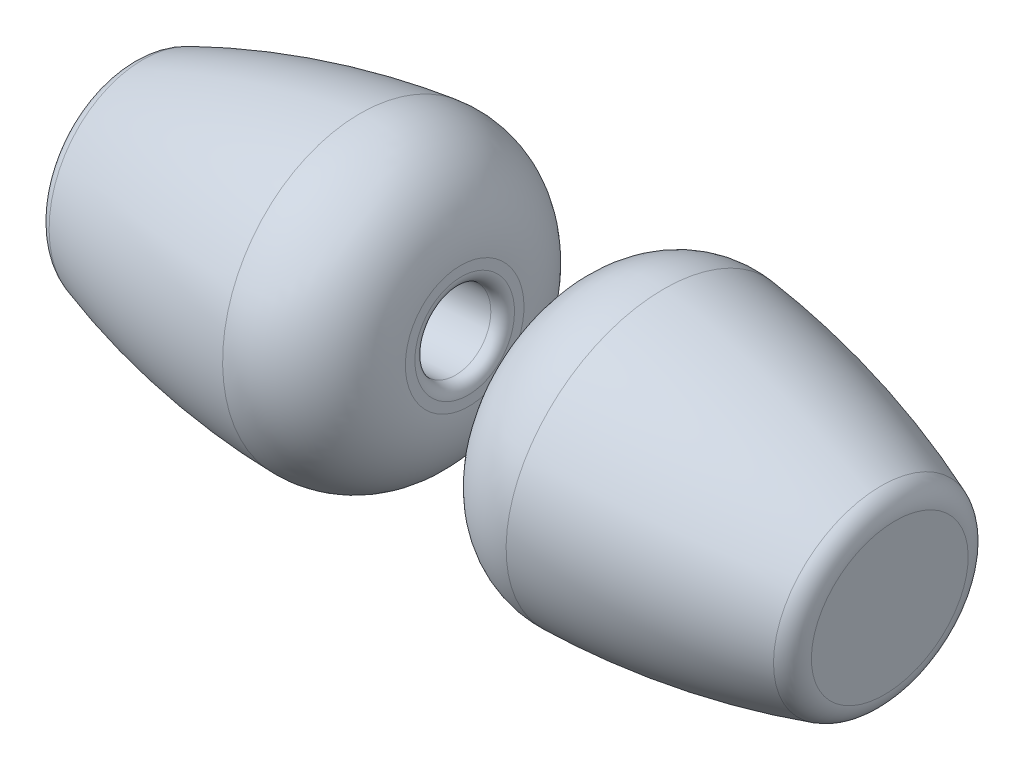
ISO-10303-21;
HEADER;
FILE_DESCRIPTION(('STEP AP214'),'2;1');
FILE_NAME('part.step','',(''),(''),'','','');
FILE_SCHEMA(('AUTOMOTIVE_DESIGN { 1 0 10303 214 1 1 1 1 }'));
ENDSEC;
DATA;
#1=APPLICATION_CONTEXT('core data for automotive mechanical design processes');
#2=APPLICATION_PROTOCOL_DEFINITION('international standard','automotive_design',2000,#1);
#3=PRODUCT_CONTEXT('',#1,'mechanical');
#4=PRODUCT('Part','Part','',(#3));
#5=PRODUCT_RELATED_PRODUCT_CATEGORY('part','',(#4));
#6=PRODUCT_DEFINITION_FORMATION('','',#4);
#7=PRODUCT_DEFINITION_CONTEXT('part definition',#1,'design');
#8=PRODUCT_DEFINITION('design','',#6,#7);
#9=PRODUCT_DEFINITION_SHAPE('','',#8);
#10=(LENGTH_UNIT() NAMED_UNIT(*) SI_UNIT(.MILLI.,.METRE.));
#11=(NAMED_UNIT(*) PLANE_ANGLE_UNIT() SI_UNIT($,.RADIAN.));
#12=(NAMED_UNIT(*) SI_UNIT($,.STERADIAN.) SOLID_ANGLE_UNIT());
#13=UNCERTAINTY_MEASURE_WITH_UNIT(LENGTH_MEASURE(1.E-05),#10,'distance_accuracy_value','');
#14=(GEOMETRIC_REPRESENTATION_CONTEXT(3) GLOBAL_UNCERTAINTY_ASSIGNED_CONTEXT((#13)) GLOBAL_UNIT_ASSIGNED_CONTEXT((#10,
#11,#12)) REPRESENTATION_CONTEXT('',''));
#15=CARTESIAN_POINT('',(0.,0.,0.));
#16=DIRECTION('',(0.,0.,1.));
#17=DIRECTION('',(1.,0.,0.));
#18=AXIS2_PLACEMENT_3D('',#15,#16,#17);
#19=CARTESIAN_POINT('',(-16.242863651309,160.834457444389,0.));
#20=DIRECTION('',(-0.997611399366225,-0.0690760150454681,0.));
#21=DIRECTION('',(-0.0690760150454681,0.997611399366225,0.));
#22=AXIS2_PLACEMENT_3D('',#19,#20,#21);
#23=PLANE('',#22);
#24=CARTESIAN_POINT('',(-15.9665595911271,156.844011846924,0.));
#25=DIRECTION('',(0.997611399366225,0.0690760150454681,0.));
#26=DIRECTION('',(-0.0690760150454681,0.997611399366225,0.));
#27=AXIS2_PLACEMENT_3D('',#24,#25,#26);
#28=CIRCLE('',#27,3.30542503677639);
#29=CARTESIAN_POINT('',(-16.1948851806992,160.141541543363,0.));
#30=VERTEX_POINT('',#29);
#31=EDGE_CURVE('E60',#30,#30,#28,.T.);
#32=ORIENTED_EDGE('',*,*,#31,.F.);
#33=EDGE_LOOP('',(#32));
#34=FACE_BOUND('',#33,.T.);
#35=ADVANCED_FACE('F45',(#34),#23,.T.);
#36=CARTESIAN_POINT('',(-3.52244998302165,157.705659481527,0.));
#37=DIRECTION('',(-0.997611399366225,-0.0690760150454681,0.));
#38=DIRECTION('',(-0.0690760150454681,0.997611399366225,0.));
#39=AXIS2_PLACEMENT_3D('',#36,#37,#38);
#40=DEGENERATE_TOROIDAL_SURFACE('',#39,28.4780833032829,34.7911511111625,.F.);
#41=CARTESIAN_POINT('',(-15.3076906681887,156.889632856932,0.));
#42=DIRECTION('',(-0.997611399366225,-0.0690760150454681,0.));
#43=DIRECTION('',(0.0690760150454681,-0.997611399366225,0.));
#44=AXIS2_PLACEMENT_3D('',#41,#42,#43);
#45=CIRCLE('',#44,4.24601176717516);
#46=CARTESIAN_POINT('',(-15.014393095476,152.653763116155,0.));
#47=VERTEX_POINT('',#46);
#48=EDGE_CURVE('E56',#47,#47,#45,.T.);
#49=ORIENTED_EDGE('',*,*,#48,.F.);
#50=EDGE_LOOP('',(#49));
#51=FACE_BOUND('',#50,.T.);
#52=CARTESIAN_POINT('',(-5.9904455974649,157.534771997379,0.));
#53=DIRECTION('',(0.997611399366225,0.0690760150454681,0.));
#54=DIRECTION('',(-0.0690760150454681,0.997611399366225,0.));
#55=AXIS2_PLACEMENT_3D('',#52,#53,#54);
#56=CIRCLE('',#55,6.225);
#57=CARTESIAN_POINT('',(-6.42044379112294,163.744902958434,0.));
#58=VERTEX_POINT('',#57);
#59=EDGE_CURVE('E65',#58,#58,#56,.T.);
#60=ORIENTED_EDGE('',*,*,#59,.F.);
#61=EDGE_LOOP('',(#60));
#62=FACE_BOUND('',#61,.T.);
#63=ADVANCED_FACE('F88',(#51,#62),#40,.F.);
#64=CARTESIAN_POINT('',(-5.7255330078988,157.553114917312,0.));
#65=DIRECTION('',(-0.997611399366225,-0.0690760150454681,0.));
#66=DIRECTION('',(-0.0690760150454681,0.997611399366225,0.));
#67=AXIS2_PLACEMENT_3D('',#64,#65,#66);
#68=DEGENERATE_TOROIDAL_SURFACE('',#67,2.50000000000004,3.73445312499997,.T.);
#69=CARTESIAN_POINT('',(-2.,157.811076057561,0.));
#70=DIRECTION('',(0.997611399366225,0.0690760150454681,0.));
#71=DIRECTION('',(-0.0690760150454681,0.997611399366225,0.));
#72=AXIS2_PLACEMENT_3D('',#69,#70,#71);
#73=CIRCLE('',#72,2.50000000000003);
#74=CARTESIAN_POINT('',(-2.17269003761367,160.305104555976,0.));
#75=VERTEX_POINT('',#74);
#76=EDGE_CURVE('E68',#75,#75,#73,.T.);
#77=ORIENTED_EDGE('',*,*,#76,.F.);
#78=EDGE_LOOP('',(#77));
#79=FACE_BOUND('',#78,.T.);
#80=ORIENTED_EDGE('',*,*,#59,.T.);
#81=EDGE_LOOP('',(#80));
#82=FACE_BOUND('',#81,.T.);
#83=ADVANCED_FACE('F94',(#79,#82),#68,.T.);
#84=CARTESIAN_POINT('',(-2.,157.811076057561,0.));
#85=DIRECTION('',(0.997611399366225,0.0690760150454681,0.));
#86=DIRECTION('',(0.0690760150454681,-0.997611399366225,0.));
#87=AXIS2_PLACEMENT_3D('',#84,#85,#86);
#88=PLANE('',#87);
#89=CARTESIAN_POINT('',(-2.,157.811076057561,0.));
#90=DIRECTION('',(-0.997611399366225,-0.0690760150454681,0.));
#91=DIRECTION('',(0.0690760150454681,-0.997611399366225,0.));
#92=AXIS2_PLACEMENT_3D('',#89,#90,#91);
#93=CIRCLE('',#92,2.09999999999999);
#94=CARTESIAN_POINT('',(-1.85494036840452,155.716092118892,0.));
#95=VERTEX_POINT('',#94);
#96=EDGE_CURVE('E11',#95,#95,#93,.F.);
#97=ORIENTED_EDGE('',*,*,#96,.F.);
#98=EDGE_LOOP('',(#97));
#99=FACE_BOUND('',#98,.T.);
#100=ORIENTED_EDGE('',*,*,#76,.T.);
#101=EDGE_LOOP('',(#100));
#102=FACE_BOUND('',#101,.T.);
#103=ADVANCED_FACE('F100',(#99,#102),#88,.T.);
#104=CARTESIAN_POINT('',(-14.9689481917609,156.91308786197,0.));
#105=DIRECTION('',(-0.997611399366225,-0.0690760150454681,0.));
#106=DIRECTION('',(-0.0690760150454681,0.997611399366225,0.));
#107=AXIS2_PLACEMENT_3D('',#104,#105,#106);
#108=TOROIDAL_SURFACE('',#107,3.30542503677639,1.);
#109=ORIENTED_EDGE('',*,*,#48,.T.);
#110=EDGE_LOOP('',(#109));
#111=FACE_BOUND('',#110,.T.);
#112=ORIENTED_EDGE('',*,*,#31,.T.);
#113=EDGE_LOOP('',(#112));
#114=FACE_BOUND('',#113,.T.);
#115=ADVANCED_FACE('F84',(#111,#114),#108,.T.);
#116=CARTESIAN_POINT('',(-11.9761139936623,157.120315907106,0.));
#117=DIRECTION('',(0.997611399366225,0.0690760150454681,0.));
#118=DIRECTION('',(0.0690760150454681,-0.997611399366225,0.));
#119=AXIS2_PLACEMENT_3D('',#116,#117,#118);
#120=CYLINDRICAL_SURFACE('',#119,1.59999999999999);
#121=CARTESIAN_POINT('',(-2.49880569968311,157.776538050038,0.));
#122=DIRECTION('',(-0.997611399366225,-0.0690760150454681,0.));
#123=DIRECTION('',(0.0690760150454681,-0.997611399366225,0.));
#124=AXIS2_PLACEMENT_3D('',#121,#122,#123);
#125=CIRCLE('',#124,1.59999999999999);
#126=CARTESIAN_POINT('',(-2.38828407561036,156.180359811052,0.));
#127=VERTEX_POINT('',#126);
#128=EDGE_CURVE('E52',#127,#127,#125,.T.);
#129=ORIENTED_EDGE('',*,*,#128,.F.);
#130=EDGE_LOOP('',(#129));
#131=FACE_BOUND('',#130,.T.);
#132=CARTESIAN_POINT('',(-11.9761139936623,157.120315907106,0.));
#133=DIRECTION('',(-0.997611399366225,-0.0690760150454681,0.));
#134=DIRECTION('',(0.0690760150454681,-0.997611399366225,0.));
#135=AXIS2_PLACEMENT_3D('',#132,#133,#134);
#136=CIRCLE('',#135,1.59999999999999);
#137=CARTESIAN_POINT('',(-11.8655923695895,155.52413766812,0.));
#138=VERTEX_POINT('',#137);
#139=EDGE_CURVE('E71',#138,#138,#136,.T.);
#140=ORIENTED_EDGE('',*,*,#139,.T.);
#141=EDGE_LOOP('',(#140));
#142=FACE_BOUND('',#141,.T.);
#143=ADVANCED_FACE('F75',(#131,#142),#120,.F.);
#144=CARTESIAN_POINT('',(-11.9761139936623,157.120315907106,0.));
#145=DIRECTION('',(0.997611399366225,0.0690760150454681,0.));
#146=DIRECTION('',(0.0690760150454681,-0.997611399366225,0.));
#147=AXIS2_PLACEMENT_3D('',#144,#145,#146);
#148=PLANE('',#147);
#149=ORIENTED_EDGE('',*,*,#139,.F.);
#150=EDGE_LOOP('',(#149));
#151=FACE_BOUND('',#150,.T.);
#152=ADVANCED_FACE('F77',(#151),#148,.T.);
#153=CARTESIAN_POINT('',(-2.49880569968311,157.776538050038,0.));
#154=DIRECTION('',(0.997611399366225,0.0690760150454681,0.));
#155=DIRECTION('',(0.0690760150454681,-0.997611399366225,0.));
#156=AXIS2_PLACEMENT_3D('',#153,#154,#155);
#157=TOROIDAL_SURFACE('',#156,2.09999999999999,0.5);
#158=ORIENTED_EDGE('',*,*,#96,.T.);
#159=EDGE_LOOP('',(#158));
#160=FACE_BOUND('',#159,.T.);
#161=ORIENTED_EDGE('',*,*,#128,.T.);
#162=EDGE_LOOP('',(#161));
#163=FACE_BOUND('',#162,.T.);
#164=ADVANCED_FACE('F47',(#160,#163),#157,.T.);
#165=CLOSED_SHELL('',(#35,#63,#83,#103,#115,#143,#152,#164));
#166=MANIFOLD_SOLID_BREP('B2',#165);
#167=CARTESIAN_POINT('',(16.242863651309,160.834457444389,0.));
#168=DIRECTION('',(0.997611399366225,-0.0690760150454681,0.));
#169=DIRECTION('',(0.0690760150454681,0.997611399366225,0.));
#170=AXIS2_PLACEMENT_3D('',#167,#168,#169);
#171=PLANE('',#170);
#172=CARTESIAN_POINT('',(15.9665595911271,156.844011846924,0.));
#173=DIRECTION('',(0.997611399366225,-0.0690760150454681,0.));
#174=DIRECTION('',(0.0690760150454681,0.997611399366225,0.));
#175=AXIS2_PLACEMENT_3D('',#172,#173,#174);
#176=CIRCLE('',#175,3.30542503677639);
#177=CARTESIAN_POINT('',(16.1948851806992,160.141541543363,0.));
#178=VERTEX_POINT('',#177);
#179=EDGE_CURVE('E205',#178,#178,#176,.T.);
#180=ORIENTED_EDGE('',*,*,#179,.T.);
#181=EDGE_LOOP('',(#180));
#182=FACE_BOUND('',#181,.T.);
#183=ADVANCED_FACE('F190',(#182),#171,.T.);
#184=CARTESIAN_POINT('',(3.52244998302165,157.705659481527,0.));
#185=DIRECTION('',(0.997611399366225,-0.0690760150454681,0.));
#186=DIRECTION('',(0.0690760150454681,0.997611399366225,0.));
#187=AXIS2_PLACEMENT_3D('',#184,#185,#186);
#188=DEGENERATE_TOROIDAL_SURFACE('',#187,28.4780833032829,34.7911511111625,.F.);
#189=CARTESIAN_POINT('',(15.3076906681887,156.889632856932,0.));
#190=DIRECTION('',(-0.997611399366225,0.0690760150454681,0.));
#191=DIRECTION('',(-0.0690760150454681,-0.997611399366225,0.));
#192=AXIS2_PLACEMENT_3D('',#189,#190,#191);
#193=CIRCLE('',#192,4.24601176717516);
#194=CARTESIAN_POINT('',(15.014393095476,152.653763116155,0.));
#195=VERTEX_POINT('',#194);
#196=EDGE_CURVE('E201',#195,#195,#193,.T.);
#197=ORIENTED_EDGE('',*,*,#196,.T.);
#198=EDGE_LOOP('',(#197));
#199=FACE_BOUND('',#198,.T.);
#200=CARTESIAN_POINT('',(5.9904455974649,157.534771997379,0.));
#201=DIRECTION('',(0.997611399366225,-0.0690760150454681,0.));
#202=DIRECTION('',(0.0690760150454681,0.997611399366225,0.));
#203=AXIS2_PLACEMENT_3D('',#200,#201,#202);
#204=CIRCLE('',#203,6.225);
#205=CARTESIAN_POINT('',(6.42044379112294,163.744902958434,0.));
#206=VERTEX_POINT('',#205);
#207=EDGE_CURVE('E210',#206,#206,#204,.T.);
#208=ORIENTED_EDGE('',*,*,#207,.T.);
#209=EDGE_LOOP('',(#208));
#210=FACE_BOUND('',#209,.T.);
#211=ADVANCED_FACE('F235',(#199,#210),#188,.F.);
#212=CARTESIAN_POINT('',(5.7255330078988,157.553114917312,0.));
#213=DIRECTION('',(0.997611399366225,-0.0690760150454681,0.));
#214=DIRECTION('',(0.0690760150454681,0.997611399366225,0.));
#215=AXIS2_PLACEMENT_3D('',#212,#213,#214);
#216=DEGENERATE_TOROIDAL_SURFACE('',#215,2.50000000000004,3.73445312499997,.T.);
#217=CARTESIAN_POINT('',(2.,157.811076057561,0.));
#218=DIRECTION('',(0.997611399366225,-0.0690760150454681,0.));
#219=DIRECTION('',(0.0690760150454681,0.997611399366225,0.));
#220=AXIS2_PLACEMENT_3D('',#217,#218,#219);
#221=CIRCLE('',#220,2.50000000000003);
#222=CARTESIAN_POINT('',(2.17269003761367,160.305104555976,0.));
#223=VERTEX_POINT('',#222);
#224=EDGE_CURVE('E213',#223,#223,#221,.T.);
#225=ORIENTED_EDGE('',*,*,#224,.T.);
#226=EDGE_LOOP('',(#225));
#227=FACE_BOUND('',#226,.T.);
#228=ORIENTED_EDGE('',*,*,#207,.F.);
#229=EDGE_LOOP('',(#228));
#230=FACE_BOUND('',#229,.T.);
#231=ADVANCED_FACE('F241',(#227,#230),#216,.T.);
#232=CARTESIAN_POINT('',(2.,157.811076057561,0.));
#233=DIRECTION('',(-0.997611399366225,0.0690760150454681,0.));
#234=DIRECTION('',(-0.0690760150454681,-0.997611399366225,0.));
#235=AXIS2_PLACEMENT_3D('',#232,#233,#234);
#236=PLANE('',#235);
#237=CARTESIAN_POINT('',(2.,157.811076057561,0.));
#238=DIRECTION('',(-0.997611399366225,0.0690760150454681,0.));
#239=DIRECTION('',(-0.0690760150454681,-0.997611399366225,0.));
#240=AXIS2_PLACEMENT_3D('',#237,#238,#239);
#241=CIRCLE('',#240,2.09999999999999);
#242=CARTESIAN_POINT('',(1.85494036840452,155.716092118892,0.));
#243=VERTEX_POINT('',#242);
#244=EDGE_CURVE('E44',#243,#243,#241,.F.);
#245=ORIENTED_EDGE('',*,*,#244,.T.);
#246=EDGE_LOOP('',(#245));
#247=FACE_BOUND('',#246,.T.);
#248=ORIENTED_EDGE('',*,*,#224,.F.);
#249=EDGE_LOOP('',(#248));
#250=FACE_BOUND('',#249,.T.);
#251=ADVANCED_FACE('F231',(#247,#250),#236,.T.);
#252=CARTESIAN_POINT('',(14.9689481917609,156.91308786197,0.));
#253=DIRECTION('',(0.997611399366225,-0.0690760150454681,0.));
#254=DIRECTION('',(0.0690760150454681,0.997611399366225,0.));
#255=AXIS2_PLACEMENT_3D('',#252,#253,#254);
#256=TOROIDAL_SURFACE('',#255,3.30542503677639,1.);
#257=ORIENTED_EDGE('',*,*,#196,.F.);
#258=EDGE_LOOP('',(#257));
#259=FACE_BOUND('',#258,.T.);
#260=ORIENTED_EDGE('',*,*,#179,.F.);
#261=EDGE_LOOP('',(#260));
#262=FACE_BOUND('',#261,.T.);
#263=ADVANCED_FACE('F224',(#259,#262),#256,.T.);
#264=CARTESIAN_POINT('',(11.9761139936623,157.120315907106,0.));
#265=DIRECTION('',(-0.997611399366225,0.0690760150454681,0.));
#266=DIRECTION('',(-0.0690760150454681,-0.997611399366225,0.));
#267=AXIS2_PLACEMENT_3D('',#264,#265,#266);
#268=CYLINDRICAL_SURFACE('',#267,1.59999999999999);
#269=CARTESIAN_POINT('',(2.49880569968311,157.776538050038,0.));
#270=DIRECTION('',(-0.997611399366225,0.0690760150454681,0.));
#271=DIRECTION('',(-0.0690760150454681,-0.997611399366225,0.));
#272=AXIS2_PLACEMENT_3D('',#269,#270,#271);
#273=CIRCLE('',#272,1.59999999999999);
#274=CARTESIAN_POINT('',(2.38828407561036,156.180359811052,0.));
#275=VERTEX_POINT('',#274);
#276=EDGE_CURVE('E197',#275,#275,#273,.T.);
#277=ORIENTED_EDGE('',*,*,#276,.T.);
#278=EDGE_LOOP('',(#277));
#279=FACE_BOUND('',#278,.T.);
#280=CARTESIAN_POINT('',(11.9761139936623,157.120315907106,0.));
#281=DIRECTION('',(-0.997611399366225,0.0690760150454681,0.));
#282=DIRECTION('',(-0.0690760150454681,-0.997611399366225,0.));
#283=AXIS2_PLACEMENT_3D('',#280,#281,#282);
#284=CIRCLE('',#283,1.59999999999999);
#285=CARTESIAN_POINT('',(11.8655923695895,155.52413766812,0.));
#286=VERTEX_POINT('',#285);
#287=EDGE_CURVE('E216',#286,#286,#284,.T.);
#288=ORIENTED_EDGE('',*,*,#287,.F.);
#289=EDGE_LOOP('',(#288));
#290=FACE_BOUND('',#289,.T.);
#291=ADVANCED_FACE('F222',(#279,#290),#268,.F.);
#292=CARTESIAN_POINT('',(11.9761139936623,157.120315907106,0.));
#293=DIRECTION('',(-0.997611399366225,0.0690760150454681,0.));
#294=DIRECTION('',(-0.0690760150454681,-0.997611399366225,0.));
#295=AXIS2_PLACEMENT_3D('',#292,#293,#294);
#296=PLANE('',#295);
#297=ORIENTED_EDGE('',*,*,#287,.T.);
#298=EDGE_LOOP('',(#297));
#299=FACE_BOUND('',#298,.T.);
#300=ADVANCED_FACE('F220',(#299),#296,.T.);
#301=CARTESIAN_POINT('',(2.49880569968311,157.776538050038,0.));
#302=DIRECTION('',(-0.997611399366225,0.0690760150454681,0.));
#303=DIRECTION('',(-0.0690760150454681,-0.997611399366225,0.));
#304=AXIS2_PLACEMENT_3D('',#301,#302,#303);
#305=TOROIDAL_SURFACE('',#304,2.09999999999999,0.5);
#306=ORIENTED_EDGE('',*,*,#244,.F.);
#307=EDGE_LOOP('',(#306));
#308=FACE_BOUND('',#307,.T.);
#309=ORIENTED_EDGE('',*,*,#276,.F.);
#310=EDGE_LOOP('',(#309));
#311=FACE_BOUND('',#310,.T.);
#312=ADVANCED_FACE('F192',(#308,#311),#305,.T.);
#313=CLOSED_SHELL('',(#183,#211,#231,#251,#263,#291,#300,#312));
#314=MANIFOLD_SOLID_BREP('B6',#313);
#315=ADVANCED_BREP_SHAPE_REPRESENTATION('',(#18,#166,#314),#14);
#316=SHAPE_DEFINITION_REPRESENTATION(#9,#315);
ENDSEC;
END-ISO-10303-21;
